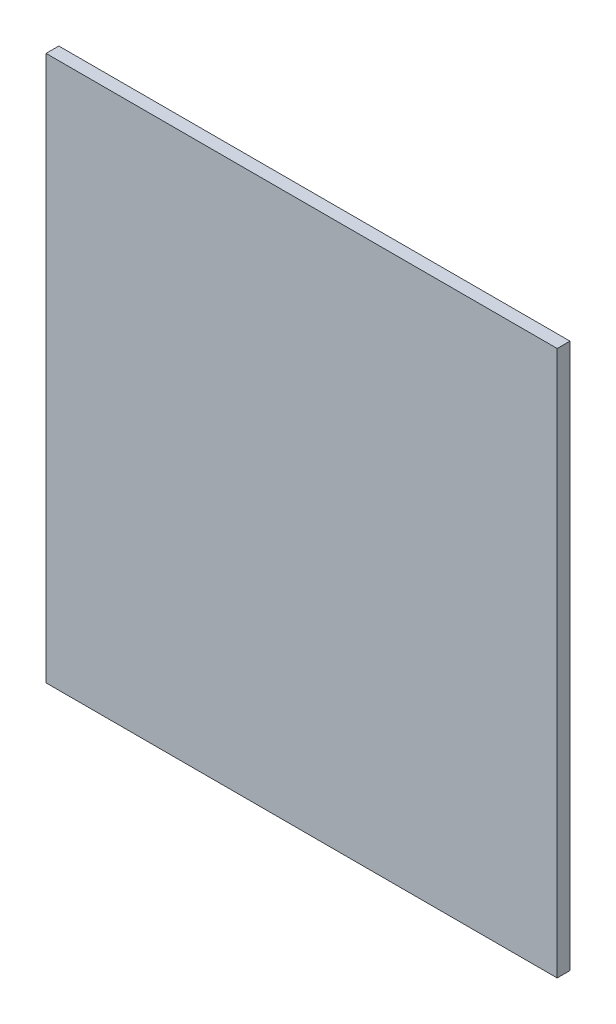
ISO-10303-21;
HEADER;
FILE_DESCRIPTION(('STEP AP214'),'2;1');
FILE_NAME('part.step','',(''),(''),'','','');
FILE_SCHEMA(('AUTOMOTIVE_DESIGN { 1 0 10303 214 1 1 1 1 }'));
ENDSEC;
DATA;
#1=APPLICATION_CONTEXT('core data for automotive mechanical design processes');
#2=APPLICATION_PROTOCOL_DEFINITION('international standard','automotive_design',2000,#1);
#3=PRODUCT_CONTEXT('',#1,'mechanical');
#4=PRODUCT('Part','Part','',(#3));
#5=PRODUCT_RELATED_PRODUCT_CATEGORY('part','',(#4));
#6=PRODUCT_DEFINITION_FORMATION('','',#4);
#7=PRODUCT_DEFINITION_CONTEXT('part definition',#1,'design');
#8=PRODUCT_DEFINITION('design','',#6,#7);
#9=PRODUCT_DEFINITION_SHAPE('','',#8);
#10=(LENGTH_UNIT() NAMED_UNIT(*) SI_UNIT(.MILLI.,.METRE.));
#11=(NAMED_UNIT(*) PLANE_ANGLE_UNIT() SI_UNIT($,.RADIAN.));
#12=(NAMED_UNIT(*) SI_UNIT($,.STERADIAN.) SOLID_ANGLE_UNIT());
#13=UNCERTAINTY_MEASURE_WITH_UNIT(LENGTH_MEASURE(1.E-05),#10,'distance_accuracy_value','');
#14=(GEOMETRIC_REPRESENTATION_CONTEXT(3) GLOBAL_UNCERTAINTY_ASSIGNED_CONTEXT((#13)) GLOBAL_UNIT_ASSIGNED_CONTEXT((#10,
#11,#12)) REPRESENTATION_CONTEXT('',''));
#15=CARTESIAN_POINT('',(0.,0.,0.));
#16=DIRECTION('',(0.,0.,1.));
#17=DIRECTION('',(1.,0.,0.));
#18=AXIS2_PLACEMENT_3D('',#15,#16,#17);
#19=CARTESIAN_POINT('',(0.,0.,0.));
#20=DIRECTION('',(0.,0.,-1.));
#21=DIRECTION('',(-1.,0.,0.));
#22=AXIS2_PLACEMENT_3D('',#19,#20,#21);
#23=PLANE('',#22);
#24=DIRECTION('',(0.,-1.,0.));
#25=VECTOR('',#24,1.);
#26=CARTESIAN_POINT('',(-200.,213.32,0.));
#27=LINE('',#26,#25);
#28=CARTESIAN_POINT('',(-200.,213.32,0.));
#29=VERTEX_POINT('',#28);
#30=CARTESIAN_POINT('',(-200.,-213.32,0.));
#31=VERTEX_POINT('',#30);
#32=EDGE_CURVE('E447',#29,#31,#27,.T.);
#33=ORIENTED_EDGE('',*,*,#32,.F.);
#34=DIRECTION('',(-1.,0.,0.));
#35=VECTOR('',#34,1.);
#36=CARTESIAN_POINT('',(200.,213.32,0.));
#37=LINE('',#36,#35);
#38=CARTESIAN_POINT('',(200.,213.32,0.));
#39=VERTEX_POINT('',#38);
#40=EDGE_CURVE('E453',#39,#29,#37,.T.);
#41=ORIENTED_EDGE('',*,*,#40,.F.);
#42=DIRECTION('',(0.,1.,0.));
#43=VECTOR('',#42,1.);
#44=CARTESIAN_POINT('',(200.,213.32,0.));
#45=LINE('',#44,#43);
#46=CARTESIAN_POINT('',(200.,-213.32,0.));
#47=VERTEX_POINT('',#46);
#48=EDGE_CURVE('E469',#47,#39,#45,.T.);
#49=ORIENTED_EDGE('',*,*,#48,.F.);
#50=DIRECTION('',(1.,0.,0.));
#51=VECTOR('',#50,1.);
#52=CARTESIAN_POINT('',(200.,-213.32,0.));
#53=LINE('',#52,#51);
#54=EDGE_CURVE('E466',#31,#47,#53,.T.);
#55=ORIENTED_EDGE('',*,*,#54,.F.);
#56=EDGE_LOOP('',(#33,#41,#49,#55));
#57=FACE_BOUND('',#56,.T.);
#58=DIRECTION('',(0.866025403784438,0.500000000000001,0.));
#59=VECTOR('',#58,1.);
#60=CARTESIAN_POINT('',(116.379888510882,-201.575879880048,0.));
#61=LINE('',#60,#59);
#62=CARTESIAN_POINT('',(159.,-176.969147038914,0.));
#63=VERTEX_POINT('',#62);
#64=CARTESIAN_POINT('',(170.,-170.618294077828,0.));
#65=VERTEX_POINT('',#64);
#66=EDGE_CURVE('E411',#63,#65,#61,.T.);
#67=ORIENTED_EDGE('',*,*,#66,.F.);
#68=DIRECTION('',(0.,1.,0.));
#69=VECTOR('',#68,1.);
#70=CARTESIAN_POINT('',(159.,0.,0.));
#71=LINE('',#70,#69);
#72=CARTESIAN_POINT('',(159.,-189.670852961086,0.));
#73=VERTEX_POINT('',#72);
#74=EDGE_CURVE('E386',#73,#63,#71,.T.);
#75=ORIENTED_EDGE('',*,*,#74,.F.);
#76=DIRECTION('',(-0.866025403784438,0.5,0.));
#77=VECTOR('',#76,1.);
#78=CARTESIAN_POINT('',(-42.3798885108816,-73.4041201199513,0.));
#79=LINE('',#78,#77);
#80=CARTESIAN_POINT('',(170.,-196.021705922172,0.));
#81=VERTEX_POINT('',#80);
#82=EDGE_CURVE('E392',#81,#73,#79,.T.);
#83=ORIENTED_EDGE('',*,*,#82,.F.);
#84=DIRECTION('',(-0.866025403784439,-0.5,0.));
#85=VECTOR('',#84,1.);
#86=CARTESIAN_POINT('',(127.379888510882,-220.628438763306,0.));
#87=LINE('',#86,#85);
#88=CARTESIAN_POINT('',(181.,-189.670852961086,0.));
#89=VERTEX_POINT('',#88);
#90=EDGE_CURVE('E420',#89,#81,#87,.T.);
#91=ORIENTED_EDGE('',*,*,#90,.F.);
#92=DIRECTION('',(0.,-1.,0.));
#93=VECTOR('',#92,1.);
#94=CARTESIAN_POINT('',(181.,0.,0.));
#95=LINE('',#94,#93);
#96=CARTESIAN_POINT('',(181.,-176.969147038914,0.));
#97=VERTEX_POINT('',#96);
#98=EDGE_CURVE('E417',#97,#89,#95,.T.);
#99=ORIENTED_EDGE('',*,*,#98,.F.);
#100=DIRECTION('',(0.866025403784438,-0.500000000000001,0.));
#101=VECTOR('',#100,1.);
#102=CARTESIAN_POINT('',(-31.3798885108816,-54.3515612366936,0.));
#103=LINE('',#102,#101);
#104=EDGE_CURVE('E414',#65,#97,#103,.T.);
#105=ORIENTED_EDGE('',*,*,#104,.F.);
#106=EDGE_LOOP('',(#67,#75,#83,#91,#99,#105));
#107=FACE_BOUND('',#106,.T.);
#108=DIRECTION('',(0.866025403784438,0.5,0.));
#109=VECTOR('',#108,1.);
#110=CARTESIAN_POINT('',(31.3798885108816,-54.3515612366938,0.));
#111=LINE('',#110,#109);
#112=CARTESIAN_POINT('',(-181.,-176.969147038914,0.));
#113=VERTEX_POINT('',#112);
#114=CARTESIAN_POINT('',(-170.,-170.618294077828,0.));
#115=VERTEX_POINT('',#114);
#116=EDGE_CURVE('E350',#113,#115,#111,.T.);
#117=ORIENTED_EDGE('',*,*,#116,.F.);
#118=DIRECTION('',(0.,1.,0.));
#119=VECTOR('',#118,1.);
#120=CARTESIAN_POINT('',(-181.,0.,0.));
#121=LINE('',#120,#119);
#122=CARTESIAN_POINT('',(-181.,-189.670852961086,0.));
#123=VERTEX_POINT('',#122);
#124=EDGE_CURVE('E325',#123,#113,#121,.T.);
#125=ORIENTED_EDGE('',*,*,#124,.F.);
#126=DIRECTION('',(-0.866025403784438,0.5,0.));
#127=VECTOR('',#126,1.);
#128=CARTESIAN_POINT('',(-127.379888510882,-220.628438763306,0.));
#129=LINE('',#128,#127);
#130=CARTESIAN_POINT('',(-170.,-196.021705922172,0.));
#131=VERTEX_POINT('',#130);
#132=EDGE_CURVE('E331',#131,#123,#129,.T.);
#133=ORIENTED_EDGE('',*,*,#132,.F.);
#134=DIRECTION('',(-0.866025403784438,-0.5,0.));
#135=VECTOR('',#134,1.);
#136=CARTESIAN_POINT('',(42.3798885108816,-73.4041201199514,0.));
#137=LINE('',#136,#135);
#138=CARTESIAN_POINT('',(-159.,-189.670852961086,0.));
#139=VERTEX_POINT('',#138);
#140=EDGE_CURVE('E359',#139,#131,#137,.T.);
#141=ORIENTED_EDGE('',*,*,#140,.F.);
#142=DIRECTION('',(0.,-1.,0.));
#143=VECTOR('',#142,1.);
#144=CARTESIAN_POINT('',(-159.,0.,0.));
#145=LINE('',#144,#143);
#146=CARTESIAN_POINT('',(-159.,-176.969147038914,0.));
#147=VERTEX_POINT('',#146);
#148=EDGE_CURVE('E356',#147,#139,#145,.T.);
#149=ORIENTED_EDGE('',*,*,#148,.F.);
#150=DIRECTION('',(0.866025403784438,-0.5,0.));
#151=VECTOR('',#150,1.);
#152=CARTESIAN_POINT('',(-116.379888510882,-201.575879880048,0.));
#153=LINE('',#152,#151);
#154=EDGE_CURVE('E353',#115,#147,#153,.T.);
#155=ORIENTED_EDGE('',*,*,#154,.F.);
#156=EDGE_LOOP('',(#117,#125,#133,#141,#149,#155));
#157=FACE_BOUND('',#156,.T.);
#158=DIRECTION('',(-0.866025403784439,-0.499999999999999,0.));
#159=VECTOR('',#158,1.);
#160=CARTESIAN_POINT('',(-31.3798885108817,54.3515612366942,0.));
#161=LINE('',#160,#159);
#162=CARTESIAN_POINT('',(181.,176.969147038914,0.));
#163=VERTEX_POINT('',#162);
#164=CARTESIAN_POINT('',(170.,170.618294077828,0.));
#165=VERTEX_POINT('',#164);
#166=EDGE_CURVE('E265',#163,#165,#161,.T.);
#167=ORIENTED_EDGE('',*,*,#166,.F.);
#168=DIRECTION('',(0.,-1.,0.));
#169=VECTOR('',#168,1.);
#170=CARTESIAN_POINT('',(181.,0.,0.));
#171=LINE('',#170,#169);
#172=CARTESIAN_POINT('',(181.,189.670852961086,0.));
#173=VERTEX_POINT('',#172);
#174=EDGE_CURVE('E260',#173,#163,#171,.T.);
#175=ORIENTED_EDGE('',*,*,#174,.F.);
#176=DIRECTION('',(0.866025403784439,-0.5,0.));
#177=VECTOR('',#176,1.);
#178=CARTESIAN_POINT('',(127.379888510882,220.628438763306,0.));
#179=LINE('',#178,#177);
#180=CARTESIAN_POINT('',(170.,196.021705922172,0.));
#181=VERTEX_POINT('',#180);
#182=EDGE_CURVE('E276',#181,#173,#179,.T.);
#183=ORIENTED_EDGE('',*,*,#182,.F.);
#184=DIRECTION('',(0.866025403784439,0.499999999999999,0.));
#185=VECTOR('',#184,1.);
#186=CARTESIAN_POINT('',(-42.3798885108817,73.4041201199518,0.));
#187=LINE('',#186,#185);
#188=CARTESIAN_POINT('',(159.,189.670852961086,0.));
#189=VERTEX_POINT('',#188);
#190=EDGE_CURVE('E300',#189,#181,#187,.T.);
#191=ORIENTED_EDGE('',*,*,#190,.F.);
#192=DIRECTION('',(0.,1.,0.));
#193=VECTOR('',#192,1.);
#194=CARTESIAN_POINT('',(159.,0.,0.));
#195=LINE('',#194,#193);
#196=CARTESIAN_POINT('',(159.,176.969147038914,0.));
#197=VERTEX_POINT('',#196);
#198=EDGE_CURVE('E297',#197,#189,#195,.T.);
#199=ORIENTED_EDGE('',*,*,#198,.F.);
#200=DIRECTION('',(-0.866025403784439,0.5,0.));
#201=VECTOR('',#200,1.);
#202=CARTESIAN_POINT('',(116.379888510882,201.575879880049,0.));
#203=LINE('',#202,#201);
#204=EDGE_CURVE('E294',#165,#197,#203,.T.);
#205=ORIENTED_EDGE('',*,*,#204,.F.);
#206=EDGE_LOOP('',(#167,#175,#183,#191,#199,#205));
#207=FACE_BOUND('',#206,.T.);
#208=DIRECTION('',(-0.866025403784438,-0.500000000000001,0.));
#209=VECTOR('',#208,1.);
#210=CARTESIAN_POINT('',(-116.379888510882,201.575879880048,0.));
#211=LINE('',#210,#209);
#212=CARTESIAN_POINT('',(-159.,176.969147038914,0.));
#213=VERTEX_POINT('',#212);
#214=CARTESIAN_POINT('',(-170.,170.618294077828,0.));
#215=VERTEX_POINT('',#214);
#216=EDGE_CURVE('E899',#213,#215,#211,.T.);
#217=ORIENTED_EDGE('',*,*,#216,.F.);
#218=DIRECTION('',(0.,-1.,0.));
#219=VECTOR('',#218,1.);
#220=CARTESIAN_POINT('',(-159.,0.,0.));
#221=LINE('',#220,#219);
#222=CARTESIAN_POINT('',(-159.,189.670852961086,0.));
#223=VERTEX_POINT('',#222);
#224=EDGE_CURVE('E257',#223,#213,#221,.T.);
#225=ORIENTED_EDGE('',*,*,#224,.F.);
#226=DIRECTION('',(0.866025403784439,-0.499999999999999,0.));
#227=VECTOR('',#226,1.);
#228=CARTESIAN_POINT('',(42.3798885108817,73.4041201199518,0.));
#229=LINE('',#228,#227);
#230=CARTESIAN_POINT('',(-170.,196.021705922172,0.));
#231=VERTEX_POINT('',#230);
#232=EDGE_CURVE('E253',#231,#223,#229,.T.);
#233=ORIENTED_EDGE('',*,*,#232,.F.);
#234=DIRECTION('',(0.866025403784439,0.499999999999999,0.));
#235=VECTOR('',#234,1.);
#236=CARTESIAN_POINT('',(-127.379888510881,220.628438763306,0.));
#237=LINE('',#236,#235);
#238=CARTESIAN_POINT('',(-181.,189.670852961086,0.));
#239=VERTEX_POINT('',#238);
#240=EDGE_CURVE('E894',#239,#231,#237,.T.);
#241=ORIENTED_EDGE('',*,*,#240,.F.);
#242=DIRECTION('',(0.,1.,0.));
#243=VECTOR('',#242,1.);
#244=CARTESIAN_POINT('',(-181.,0.,0.));
#245=LINE('',#244,#243);
#246=CARTESIAN_POINT('',(-181.,176.969147038914,0.));
#247=VERTEX_POINT('',#246);
#248=EDGE_CURVE('E910',#247,#239,#245,.T.);
#249=ORIENTED_EDGE('',*,*,#248,.F.);
#250=DIRECTION('',(-0.866025403784438,0.500000000000001,0.));
#251=VECTOR('',#250,1.);
#252=CARTESIAN_POINT('',(31.3798885108816,54.3515612366936,0.));
#253=LINE('',#252,#251);
#254=EDGE_CURVE('E903',#215,#247,#253,.T.);
#255=ORIENTED_EDGE('',*,*,#254,.F.);
#256=EDGE_LOOP('',(#217,#225,#233,#241,#249,#255));
#257=FACE_BOUND('',#256,.T.);
#258=ADVANCED_FACE('F45',(#57,#107,#157,#207,#257),#23,.T.);
#259=CARTESIAN_POINT('',(-200.,213.32,10.));
#260=DIRECTION('',(1.,0.,0.));
#261=DIRECTION('',(0.,1.,0.));
#262=AXIS2_PLACEMENT_3D('',#259,#260,#261);
#263=PLANE('',#262);
#264=ORIENTED_EDGE('',*,*,#32,.T.);
#265=DIRECTION('',(0.,0.,-1.));
#266=VECTOR('',#265,1.);
#267=CARTESIAN_POINT('',(-200.,-213.32,10.));
#268=LINE('',#267,#266);
#269=CARTESIAN_POINT('',(-200.,-213.32,10.));
#270=VERTEX_POINT('',#269);
#271=EDGE_CURVE('E11',#270,#31,#268,.T.);
#272=ORIENTED_EDGE('',*,*,#271,.F.);
#273=DIRECTION('',(0.,-1.,0.));
#274=VECTOR('',#273,1.);
#275=CARTESIAN_POINT('',(-200.,213.32,10.));
#276=LINE('',#275,#274);
#277=CARTESIAN_POINT('',(-200.,213.32,10.));
#278=VERTEX_POINT('',#277);
#279=EDGE_CURVE('E448',#278,#270,#276,.T.);
#280=ORIENTED_EDGE('',*,*,#279,.F.);
#281=DIRECTION('',(0.,0.,-1.));
#282=VECTOR('',#281,1.);
#283=CARTESIAN_POINT('',(-200.,213.32,10.));
#284=LINE('',#283,#282);
#285=EDGE_CURVE('E462',#278,#29,#284,.T.);
#286=ORIENTED_EDGE('',*,*,#285,.T.);
#287=EDGE_LOOP('',(#264,#272,#280,#286));
#288=FACE_BOUND('',#287,.T.);
#289=ADVANCED_FACE('F47',(#288),#263,.F.);
#290=CARTESIAN_POINT('',(200.,-213.32,10.));
#291=DIRECTION('',(0.,1.,0.));
#292=DIRECTION('',(-1.,0.,0.));
#293=AXIS2_PLACEMENT_3D('',#290,#291,#292);
#294=PLANE('',#293);
#295=ORIENTED_EDGE('',*,*,#54,.T.);
#296=DIRECTION('',(0.,0.,-1.));
#297=VECTOR('',#296,1.);
#298=CARTESIAN_POINT('',(200.,-213.32,10.));
#299=LINE('',#298,#297);
#300=CARTESIAN_POINT('',(200.,-213.32,10.));
#301=VERTEX_POINT('',#300);
#302=EDGE_CURVE('E54',#301,#47,#299,.T.);
#303=ORIENTED_EDGE('',*,*,#302,.F.);
#304=DIRECTION('',(1.,0.,0.));
#305=VECTOR('',#304,1.);
#306=CARTESIAN_POINT('',(200.,-213.32,10.));
#307=LINE('',#306,#305);
#308=EDGE_CURVE('E452',#270,#301,#307,.T.);
#309=ORIENTED_EDGE('',*,*,#308,.F.);
#310=ORIENTED_EDGE('',*,*,#271,.T.);
#311=EDGE_LOOP('',(#295,#303,#309,#310));
#312=FACE_BOUND('',#311,.T.);
#313=ADVANCED_FACE('F502',(#312),#294,.F.);
#314=CARTESIAN_POINT('',(200.,213.32,10.));
#315=DIRECTION('',(-1.,0.,0.));
#316=DIRECTION('',(0.,-1.,0.));
#317=AXIS2_PLACEMENT_3D('',#314,#315,#316);
#318=PLANE('',#317);
#319=ORIENTED_EDGE('',*,*,#48,.T.);
#320=DIRECTION('',(0.,0.,-1.));
#321=VECTOR('',#320,1.);
#322=CARTESIAN_POINT('',(200.,213.32,10.));
#323=LINE('',#322,#321);
#324=CARTESIAN_POINT('',(200.,213.32,10.));
#325=VERTEX_POINT('',#324);
#326=EDGE_CURVE('E477',#325,#39,#323,.T.);
#327=ORIENTED_EDGE('',*,*,#326,.F.);
#328=DIRECTION('',(0.,1.,0.));
#329=VECTOR('',#328,1.);
#330=CARTESIAN_POINT('',(200.,213.32,10.));
#331=LINE('',#330,#329);
#332=EDGE_CURVE('E456',#301,#325,#331,.T.);
#333=ORIENTED_EDGE('',*,*,#332,.F.);
#334=ORIENTED_EDGE('',*,*,#302,.T.);
#335=EDGE_LOOP('',(#319,#327,#333,#334));
#336=FACE_BOUND('',#335,.T.);
#337=ADVANCED_FACE('F486',(#336),#318,.F.);
#338=CARTESIAN_POINT('',(200.,213.32,10.));
#339=DIRECTION('',(0.,-1.,0.));
#340=DIRECTION('',(1.,0.,0.));
#341=AXIS2_PLACEMENT_3D('',#338,#339,#340);
#342=PLANE('',#341);
#343=ORIENTED_EDGE('',*,*,#40,.T.);
#344=ORIENTED_EDGE('',*,*,#285,.F.);
#345=DIRECTION('',(-1.,0.,0.));
#346=VECTOR('',#345,1.);
#347=CARTESIAN_POINT('',(200.,213.32,10.));
#348=LINE('',#347,#346);
#349=EDGE_CURVE('E459',#325,#278,#348,.T.);
#350=ORIENTED_EDGE('',*,*,#349,.F.);
#351=ORIENTED_EDGE('',*,*,#326,.T.);
#352=EDGE_LOOP('',(#343,#344,#350,#351));
#353=FACE_BOUND('',#352,.T.);
#354=ADVANCED_FACE('F495',(#353),#342,.F.);
#355=CARTESIAN_POINT('',(0.,0.,10.));
#356=DIRECTION('',(0.,0.,-1.));
#357=DIRECTION('',(-1.,0.,0.));
#358=AXIS2_PLACEMENT_3D('',#355,#356,#357);
#359=PLANE('',#358);
#360=ORIENTED_EDGE('',*,*,#279,.T.);
#361=ORIENTED_EDGE('',*,*,#308,.T.);
#362=ORIENTED_EDGE('',*,*,#332,.T.);
#363=ORIENTED_EDGE('',*,*,#349,.T.);
#364=EDGE_LOOP('',(#360,#361,#362,#363));
#365=FACE_BOUND('',#364,.T.);
#366=ADVANCED_FACE('F501',(#365),#359,.F.);
#367=CARTESIAN_POINT('',(159.,0.,-10.));
#368=DIRECTION('',(1.,0.,0.));
#369=DIRECTION('',(0.,0.,-1.));
#370=AXIS2_PLACEMENT_3D('',#367,#368,#369);
#371=PLANE('',#370);
#372=ORIENTED_EDGE('',*,*,#74,.T.);
#373=DIRECTION('',(0.,0.,1.));
#374=VECTOR('',#373,1.);
#375=CARTESIAN_POINT('',(159.,-176.969147038914,-10.));
#376=LINE('',#375,#374);
#377=CARTESIAN_POINT('',(159.,-176.969147038914,-10.));
#378=VERTEX_POINT('',#377);
#379=EDGE_CURVE('E444',#378,#63,#376,.T.);
#380=ORIENTED_EDGE('',*,*,#379,.F.);
#381=DIRECTION('',(0.,1.,0.));
#382=VECTOR('',#381,1.);
#383=CARTESIAN_POINT('',(159.,0.,-10.));
#384=LINE('',#383,#382);
#385=CARTESIAN_POINT('',(159.,-189.670852961086,-10.));
#386=VERTEX_POINT('',#385);
#387=EDGE_CURVE('E387',#386,#378,#384,.T.);
#388=ORIENTED_EDGE('',*,*,#387,.F.);
#389=DIRECTION('',(0.,0.,1.));
#390=VECTOR('',#389,1.);
#391=CARTESIAN_POINT('',(159.,-189.670852961086,-10.));
#392=LINE('',#391,#390);
#393=EDGE_CURVE('E407',#386,#73,#392,.T.);
#394=ORIENTED_EDGE('',*,*,#393,.T.);
#395=EDGE_LOOP('',(#372,#380,#388,#394));
#396=FACE_BOUND('',#395,.T.);
#397=ADVANCED_FACE('F520',(#396),#371,.F.);
#398=CARTESIAN_POINT('',(116.379888510882,-201.575879880048,-10.));
#399=DIRECTION('',(0.500000000000001,-0.866025403784438,0.));
#400=DIRECTION('',(0.866025403784438,0.500000000000001,0.));
#401=AXIS2_PLACEMENT_3D('',#398,#399,#400);
#402=PLANE('',#401);
#403=ORIENTED_EDGE('',*,*,#66,.T.);
#404=DIRECTION('',(0.,0.,1.));
#405=VECTOR('',#404,1.);
#406=CARTESIAN_POINT('',(170.,-170.618294077828,-10.));
#407=LINE('',#406,#405);
#408=CARTESIAN_POINT('',(170.,-170.618294077828,-10.));
#409=VERTEX_POINT('',#408);
#410=EDGE_CURVE('E440',#409,#65,#407,.T.);
#411=ORIENTED_EDGE('',*,*,#410,.F.);
#412=DIRECTION('',(0.866025403784438,0.500000000000001,0.));
#413=VECTOR('',#412,1.);
#414=CARTESIAN_POINT('',(116.379888510882,-201.575879880048,-10.));
#415=LINE('',#414,#413);
#416=EDGE_CURVE('E391',#378,#409,#415,.T.);
#417=ORIENTED_EDGE('',*,*,#416,.F.);
#418=ORIENTED_EDGE('',*,*,#379,.T.);
#419=EDGE_LOOP('',(#403,#411,#417,#418));
#420=FACE_BOUND('',#419,.T.);
#421=ADVANCED_FACE('F524',(#420),#402,.F.);
#422=CARTESIAN_POINT('',(-31.3798885108816,-54.3515612366936,-10.));
#423=DIRECTION('',(-0.500000000000001,-0.866025403784438,0.));
#424=DIRECTION('',(0.866025403784438,-0.500000000000001,0.));
#425=AXIS2_PLACEMENT_3D('',#422,#423,#424);
#426=PLANE('',#425);
#427=ORIENTED_EDGE('',*,*,#104,.T.);
#428=DIRECTION('',(0.,0.,1.));
#429=VECTOR('',#428,1.);
#430=CARTESIAN_POINT('',(181.,-176.969147038914,-10.));
#431=LINE('',#430,#429);
#432=CARTESIAN_POINT('',(181.,-176.969147038914,-10.));
#433=VERTEX_POINT('',#432);
#434=EDGE_CURVE('E436',#433,#97,#431,.T.);
#435=ORIENTED_EDGE('',*,*,#434,.F.);
#436=DIRECTION('',(0.866025403784438,-0.500000000000001,0.));
#437=VECTOR('',#436,1.);
#438=CARTESIAN_POINT('',(-31.3798885108816,-54.3515612366936,-10.));
#439=LINE('',#438,#437);
#440=EDGE_CURVE('E395',#409,#433,#439,.T.);
#441=ORIENTED_EDGE('',*,*,#440,.F.);
#442=ORIENTED_EDGE('',*,*,#410,.T.);
#443=EDGE_LOOP('',(#427,#435,#441,#442));
#444=FACE_BOUND('',#443,.T.);
#445=ADVANCED_FACE('F529',(#444),#426,.F.);
#446=CARTESIAN_POINT('',(181.,0.,-10.));
#447=DIRECTION('',(-1.,0.,0.));
#448=DIRECTION('',(0.,0.,1.));
#449=AXIS2_PLACEMENT_3D('',#446,#447,#448);
#450=PLANE('',#449);
#451=ORIENTED_EDGE('',*,*,#98,.T.);
#452=DIRECTION('',(0.,0.,1.));
#453=VECTOR('',#452,1.);
#454=CARTESIAN_POINT('',(181.,-189.670852961086,-10.));
#455=LINE('',#454,#453);
#456=CARTESIAN_POINT('',(181.,-189.670852961086,-10.));
#457=VERTEX_POINT('',#456);
#458=EDGE_CURVE('E432',#457,#89,#455,.T.);
#459=ORIENTED_EDGE('',*,*,#458,.F.);
#460=DIRECTION('',(0.,-1.,0.));
#461=VECTOR('',#460,1.);
#462=CARTESIAN_POINT('',(181.,0.,-10.));
#463=LINE('',#462,#461);
#464=EDGE_CURVE('E398',#433,#457,#463,.T.);
#465=ORIENTED_EDGE('',*,*,#464,.F.);
#466=ORIENTED_EDGE('',*,*,#434,.T.);
#467=EDGE_LOOP('',(#451,#459,#465,#466));
#468=FACE_BOUND('',#467,.T.);
#469=ADVANCED_FACE('F535',(#468),#450,.F.);
#470=CARTESIAN_POINT('',(127.379888510882,-220.628438763306,-10.));
#471=DIRECTION('',(-0.5,0.866025403784439,0.));
#472=DIRECTION('',(-0.866025403784439,-0.5,0.));
#473=AXIS2_PLACEMENT_3D('',#470,#471,#472);
#474=PLANE('',#473);
#475=ORIENTED_EDGE('',*,*,#90,.T.);
#476=DIRECTION('',(0.,0.,1.));
#477=VECTOR('',#476,1.);
#478=CARTESIAN_POINT('',(170.,-196.021705922172,-10.));
#479=LINE('',#478,#477);
#480=CARTESIAN_POINT('',(170.,-196.021705922172,-10.));
#481=VERTEX_POINT('',#480);
#482=EDGE_CURVE('E429',#481,#81,#479,.T.);
#483=ORIENTED_EDGE('',*,*,#482,.F.);
#484=DIRECTION('',(-0.866025403784439,-0.5,0.));
#485=VECTOR('',#484,1.);
#486=CARTESIAN_POINT('',(127.379888510882,-220.628438763306,-10.));
#487=LINE('',#486,#485);
#488=EDGE_CURVE('E401',#457,#481,#487,.T.);
#489=ORIENTED_EDGE('',*,*,#488,.F.);
#490=ORIENTED_EDGE('',*,*,#458,.T.);
#491=EDGE_LOOP('',(#475,#483,#489,#490));
#492=FACE_BOUND('',#491,.T.);
#493=ADVANCED_FACE('F539',(#492),#474,.F.);
#494=CARTESIAN_POINT('',(-42.3798885108816,-73.4041201199513,-10.));
#495=DIRECTION('',(0.5,0.866025403784438,0.));
#496=DIRECTION('',(-0.866025403784438,0.5,0.));
#497=AXIS2_PLACEMENT_3D('',#494,#495,#496);
#498=PLANE('',#497);
#499=ORIENTED_EDGE('',*,*,#82,.T.);
#500=ORIENTED_EDGE('',*,*,#393,.F.);
#501=DIRECTION('',(-0.866025403784438,0.5,0.));
#502=VECTOR('',#501,1.);
#503=CARTESIAN_POINT('',(-42.3798885108816,-73.4041201199513,-10.));
#504=LINE('',#503,#502);
#505=EDGE_CURVE('E404',#481,#386,#504,.T.);
#506=ORIENTED_EDGE('',*,*,#505,.F.);
#507=ORIENTED_EDGE('',*,*,#482,.T.);
#508=EDGE_LOOP('',(#499,#500,#506,#507));
#509=FACE_BOUND('',#508,.T.);
#510=ADVANCED_FACE('F543',(#509),#498,.F.);
#511=CARTESIAN_POINT('',(0.,0.,-10.));
#512=DIRECTION('',(0.,0.,-1.));
#513=DIRECTION('',(-1.,0.,0.));
#514=AXIS2_PLACEMENT_3D('',#511,#512,#513);
#515=PLANE('',#514);
#516=ORIENTED_EDGE('',*,*,#387,.T.);
#517=ORIENTED_EDGE('',*,*,#416,.T.);
#518=ORIENTED_EDGE('',*,*,#440,.T.);
#519=ORIENTED_EDGE('',*,*,#464,.T.);
#520=ORIENTED_EDGE('',*,*,#488,.T.);
#521=ORIENTED_EDGE('',*,*,#505,.T.);
#522=EDGE_LOOP('',(#516,#517,#518,#519,#520,#521));
#523=FACE_BOUND('',#522,.T.);
#524=ADVANCED_FACE('F547',(#523),#515,.T.);
#525=CARTESIAN_POINT('',(-181.,0.,-10.));
#526=DIRECTION('',(1.,0.,0.));
#527=DIRECTION('',(0.,0.,-1.));
#528=AXIS2_PLACEMENT_3D('',#525,#526,#527);
#529=PLANE('',#528);
#530=ORIENTED_EDGE('',*,*,#124,.T.);
#531=DIRECTION('',(0.,0.,1.));
#532=VECTOR('',#531,1.);
#533=CARTESIAN_POINT('',(-181.,-176.969147038914,-10.));
#534=LINE('',#533,#532);
#535=CARTESIAN_POINT('',(-181.,-176.969147038914,-10.));
#536=VERTEX_POINT('',#535);
#537=EDGE_CURVE('E383',#536,#113,#534,.T.);
#538=ORIENTED_EDGE('',*,*,#537,.F.);
#539=DIRECTION('',(0.,1.,0.));
#540=VECTOR('',#539,1.);
#541=CARTESIAN_POINT('',(-181.,0.,-10.));
#542=LINE('',#541,#540);
#543=CARTESIAN_POINT('',(-181.,-189.670852961086,-10.));
#544=VERTEX_POINT('',#543);
#545=EDGE_CURVE('E326',#544,#536,#542,.T.);
#546=ORIENTED_EDGE('',*,*,#545,.F.);
#547=DIRECTION('',(0.,0.,1.));
#548=VECTOR('',#547,1.);
#549=CARTESIAN_POINT('',(-181.,-189.670852961086,-10.));
#550=LINE('',#549,#548);
#551=EDGE_CURVE('E346',#544,#123,#550,.T.);
#552=ORIENTED_EDGE('',*,*,#551,.T.);
#553=EDGE_LOOP('',(#530,#538,#546,#552));
#554=FACE_BOUND('',#553,.T.);
#555=ADVANCED_FACE('F551',(#554),#529,.F.);
#556=CARTESIAN_POINT('',(31.3798885108816,-54.3515612366938,-10.));
#557=DIRECTION('',(0.5,-0.866025403784438,0.));
#558=DIRECTION('',(0.866025403784438,0.5,0.));
#559=AXIS2_PLACEMENT_3D('',#556,#557,#558);
#560=PLANE('',#559);
#561=ORIENTED_EDGE('',*,*,#116,.T.);
#562=DIRECTION('',(0.,0.,1.));
#563=VECTOR('',#562,1.);
#564=CARTESIAN_POINT('',(-170.,-170.618294077828,-10.));
#565=LINE('',#564,#563);
#566=CARTESIAN_POINT('',(-170.,-170.618294077828,-10.));
#567=VERTEX_POINT('',#566);
#568=EDGE_CURVE('E379',#567,#115,#565,.T.);
#569=ORIENTED_EDGE('',*,*,#568,.F.);
#570=DIRECTION('',(0.866025403784438,0.5,0.));
#571=VECTOR('',#570,1.);
#572=CARTESIAN_POINT('',(31.3798885108816,-54.3515612366938,-10.));
#573=LINE('',#572,#571);
#574=EDGE_CURVE('E330',#536,#567,#573,.T.);
#575=ORIENTED_EDGE('',*,*,#574,.F.);
#576=ORIENTED_EDGE('',*,*,#537,.T.);
#577=EDGE_LOOP('',(#561,#569,#575,#576));
#578=FACE_BOUND('',#577,.T.);
#579=ADVANCED_FACE('F555',(#578),#560,.F.);
#580=CARTESIAN_POINT('',(-116.379888510882,-201.575879880048,-10.));
#581=DIRECTION('',(-0.5,-0.866025403784438,0.));
#582=DIRECTION('',(0.866025403784438,-0.5,0.));
#583=AXIS2_PLACEMENT_3D('',#580,#581,#582);
#584=PLANE('',#583);
#585=ORIENTED_EDGE('',*,*,#154,.T.);
#586=DIRECTION('',(0.,0.,1.));
#587=VECTOR('',#586,1.);
#588=CARTESIAN_POINT('',(-159.,-176.969147038914,-10.));
#589=LINE('',#588,#587);
#590=CARTESIAN_POINT('',(-159.,-176.969147038914,-10.));
#591=VERTEX_POINT('',#590);
#592=EDGE_CURVE('E375',#591,#147,#589,.T.);
#593=ORIENTED_EDGE('',*,*,#592,.F.);
#594=DIRECTION('',(0.866025403784438,-0.5,0.));
#595=VECTOR('',#594,1.);
#596=CARTESIAN_POINT('',(-116.379888510882,-201.575879880048,-10.));
#597=LINE('',#596,#595);
#598=EDGE_CURVE('E334',#567,#591,#597,.T.);
#599=ORIENTED_EDGE('',*,*,#598,.F.);
#600=ORIENTED_EDGE('',*,*,#568,.T.);
#601=EDGE_LOOP('',(#585,#593,#599,#600));
#602=FACE_BOUND('',#601,.T.);
#603=ADVANCED_FACE('F559',(#602),#584,.F.);
#604=CARTESIAN_POINT('',(-159.,0.,-10.));
#605=DIRECTION('',(-1.,0.,0.));
#606=DIRECTION('',(0.,0.,1.));
#607=AXIS2_PLACEMENT_3D('',#604,#605,#606);
#608=PLANE('',#607);
#609=ORIENTED_EDGE('',*,*,#148,.T.);
#610=DIRECTION('',(0.,0.,1.));
#611=VECTOR('',#610,1.);
#612=CARTESIAN_POINT('',(-159.,-189.670852961086,-10.));
#613=LINE('',#612,#611);
#614=CARTESIAN_POINT('',(-159.,-189.670852961086,-10.));
#615=VERTEX_POINT('',#614);
#616=EDGE_CURVE('E371',#615,#139,#613,.T.);
#617=ORIENTED_EDGE('',*,*,#616,.F.);
#618=DIRECTION('',(0.,-1.,0.));
#619=VECTOR('',#618,1.);
#620=CARTESIAN_POINT('',(-159.,0.,-10.));
#621=LINE('',#620,#619);
#622=EDGE_CURVE('E337',#591,#615,#621,.T.);
#623=ORIENTED_EDGE('',*,*,#622,.F.);
#624=ORIENTED_EDGE('',*,*,#592,.T.);
#625=EDGE_LOOP('',(#609,#617,#623,#624));
#626=FACE_BOUND('',#625,.T.);
#627=ADVANCED_FACE('F563',(#626),#608,.F.);
#628=CARTESIAN_POINT('',(42.3798885108816,-73.4041201199514,-10.));
#629=DIRECTION('',(-0.5,0.866025403784438,0.));
#630=DIRECTION('',(-0.866025403784438,-0.5,0.));
#631=AXIS2_PLACEMENT_3D('',#628,#629,#630);
#632=PLANE('',#631);
#633=ORIENTED_EDGE('',*,*,#140,.T.);
#634=DIRECTION('',(0.,0.,1.));
#635=VECTOR('',#634,1.);
#636=CARTESIAN_POINT('',(-170.,-196.021705922172,-10.));
#637=LINE('',#636,#635);
#638=CARTESIAN_POINT('',(-170.,-196.021705922172,-10.));
#639=VERTEX_POINT('',#638);
#640=EDGE_CURVE('E368',#639,#131,#637,.T.);
#641=ORIENTED_EDGE('',*,*,#640,.F.);
#642=DIRECTION('',(-0.866025403784438,-0.5,0.));
#643=VECTOR('',#642,1.);
#644=CARTESIAN_POINT('',(42.3798885108816,-73.4041201199514,-10.));
#645=LINE('',#644,#643);
#646=EDGE_CURVE('E340',#615,#639,#645,.T.);
#647=ORIENTED_EDGE('',*,*,#646,.F.);
#648=ORIENTED_EDGE('',*,*,#616,.T.);
#649=EDGE_LOOP('',(#633,#641,#647,#648));
#650=FACE_BOUND('',#649,.T.);
#651=ADVANCED_FACE('F567',(#650),#632,.F.);
#652=CARTESIAN_POINT('',(-127.379888510882,-220.628438763306,-10.));
#653=DIRECTION('',(0.5,0.866025403784438,0.));
#654=DIRECTION('',(-0.866025403784438,0.5,0.));
#655=AXIS2_PLACEMENT_3D('',#652,#653,#654);
#656=PLANE('',#655);
#657=ORIENTED_EDGE('',*,*,#132,.T.);
#658=ORIENTED_EDGE('',*,*,#551,.F.);
#659=DIRECTION('',(-0.866025403784438,0.5,0.));
#660=VECTOR('',#659,1.);
#661=CARTESIAN_POINT('',(-127.379888510882,-220.628438763306,-10.));
#662=LINE('',#661,#660);
#663=EDGE_CURVE('E343',#639,#544,#662,.T.);
#664=ORIENTED_EDGE('',*,*,#663,.F.);
#665=ORIENTED_EDGE('',*,*,#640,.T.);
#666=EDGE_LOOP('',(#657,#658,#664,#665));
#667=FACE_BOUND('',#666,.T.);
#668=ADVANCED_FACE('F571',(#667),#656,.F.);
#669=CARTESIAN_POINT('',(0.,0.,-10.));
#670=DIRECTION('',(0.,0.,-1.));
#671=DIRECTION('',(-1.,0.,0.));
#672=AXIS2_PLACEMENT_3D('',#669,#670,#671);
#673=PLANE('',#672);
#674=ORIENTED_EDGE('',*,*,#545,.T.);
#675=ORIENTED_EDGE('',*,*,#574,.T.);
#676=ORIENTED_EDGE('',*,*,#598,.T.);
#677=ORIENTED_EDGE('',*,*,#622,.T.);
#678=ORIENTED_EDGE('',*,*,#646,.T.);
#679=ORIENTED_EDGE('',*,*,#663,.T.);
#680=EDGE_LOOP('',(#674,#675,#676,#677,#678,#679));
#681=FACE_BOUND('',#680,.T.);
#682=ADVANCED_FACE('F575',(#681),#673,.T.);
#683=CARTESIAN_POINT('',(181.,0.,-10.));
#684=DIRECTION('',(-1.,0.,0.));
#685=DIRECTION('',(0.,0.,1.));
#686=AXIS2_PLACEMENT_3D('',#683,#684,#685);
#687=PLANE('',#686);
#688=ORIENTED_EDGE('',*,*,#174,.T.);
#689=DIRECTION('',(0.,0.,1.));
#690=VECTOR('',#689,1.);
#691=CARTESIAN_POINT('',(181.,176.969147038914,-10.));
#692=LINE('',#691,#690);
#693=CARTESIAN_POINT('',(181.,176.969147038914,-10.));
#694=VERTEX_POINT('',#693);
#695=EDGE_CURVE('E322',#694,#163,#692,.T.);
#696=ORIENTED_EDGE('',*,*,#695,.F.);
#697=DIRECTION('',(0.,-1.,0.));
#698=VECTOR('',#697,1.);
#699=CARTESIAN_POINT('',(181.,0.,-10.));
#700=LINE('',#699,#698);
#701=CARTESIAN_POINT('',(181.,189.670852961086,-10.));
#702=VERTEX_POINT('',#701);
#703=EDGE_CURVE('E271',#702,#694,#700,.T.);
#704=ORIENTED_EDGE('',*,*,#703,.F.);
#705=DIRECTION('',(0.,0.,1.));
#706=VECTOR('',#705,1.);
#707=CARTESIAN_POINT('',(181.,189.670852961086,-10.));
#708=LINE('',#707,#706);
#709=EDGE_CURVE('E290',#702,#173,#708,.T.);
#710=ORIENTED_EDGE('',*,*,#709,.T.);
#711=EDGE_LOOP('',(#688,#696,#704,#710));
#712=FACE_BOUND('',#711,.T.);
#713=ADVANCED_FACE('F579',(#712),#687,.F.);
#714=CARTESIAN_POINT('',(-31.3798885108817,54.3515612366942,-10.));
#715=DIRECTION('',(-0.499999999999999,0.866025403784439,0.));
#716=DIRECTION('',(-0.866025403784439,-0.499999999999999,0.));
#717=AXIS2_PLACEMENT_3D('',#714,#715,#716);
#718=PLANE('',#717);
#719=ORIENTED_EDGE('',*,*,#166,.T.);
#720=DIRECTION('',(0.,0.,1.));
#721=VECTOR('',#720,1.);
#722=CARTESIAN_POINT('',(170.,170.618294077828,-10.));
#723=LINE('',#722,#721);
#724=CARTESIAN_POINT('',(170.,170.618294077828,-10.));
#725=VERTEX_POINT('',#724);
#726=EDGE_CURVE('E318',#725,#165,#723,.T.);
#727=ORIENTED_EDGE('',*,*,#726,.F.);
#728=DIRECTION('',(-0.866025403784439,-0.499999999999999,0.));
#729=VECTOR('',#728,1.);
#730=CARTESIAN_POINT('',(-31.3798885108817,54.3515612366942,-10.));
#731=LINE('',#730,#729);
#732=EDGE_CURVE('E275',#694,#725,#731,.T.);
#733=ORIENTED_EDGE('',*,*,#732,.F.);
#734=ORIENTED_EDGE('',*,*,#695,.T.);
#735=EDGE_LOOP('',(#719,#727,#733,#734));
#736=FACE_BOUND('',#735,.T.);
#737=ADVANCED_FACE('F583',(#736),#718,.F.);
#738=CARTESIAN_POINT('',(116.379888510882,201.575879880049,-10.));
#739=DIRECTION('',(0.5,0.866025403784439,0.));
#740=DIRECTION('',(-0.866025403784439,0.5,0.));
#741=AXIS2_PLACEMENT_3D('',#738,#739,#740);
#742=PLANE('',#741);
#743=ORIENTED_EDGE('',*,*,#204,.T.);
#744=DIRECTION('',(0.,0.,1.));
#745=VECTOR('',#744,1.);
#746=CARTESIAN_POINT('',(159.,176.969147038914,-10.));
#747=LINE('',#746,#745);
#748=CARTESIAN_POINT('',(159.,176.969147038914,-10.));
#749=VERTEX_POINT('',#748);
#750=EDGE_CURVE('E314',#749,#197,#747,.T.);
#751=ORIENTED_EDGE('',*,*,#750,.F.);
#752=DIRECTION('',(-0.866025403784439,0.5,0.));
#753=VECTOR('',#752,1.);
#754=CARTESIAN_POINT('',(116.379888510882,201.575879880049,-10.));
#755=LINE('',#754,#753);
#756=EDGE_CURVE('E279',#725,#749,#755,.T.);
#757=ORIENTED_EDGE('',*,*,#756,.F.);
#758=ORIENTED_EDGE('',*,*,#726,.T.);
#759=EDGE_LOOP('',(#743,#751,#757,#758));
#760=FACE_BOUND('',#759,.T.);
#761=ADVANCED_FACE('F587',(#760),#742,.F.);
#762=CARTESIAN_POINT('',(159.,0.,-10.));
#763=DIRECTION('',(1.,0.,0.));
#764=DIRECTION('',(0.,0.,-1.));
#765=AXIS2_PLACEMENT_3D('',#762,#763,#764);
#766=PLANE('',#765);
#767=ORIENTED_EDGE('',*,*,#198,.T.);
#768=DIRECTION('',(0.,0.,1.));
#769=VECTOR('',#768,1.);
#770=CARTESIAN_POINT('',(159.,189.670852961086,-10.));
#771=LINE('',#770,#769);
#772=CARTESIAN_POINT('',(159.,189.670852961086,-10.));
#773=VERTEX_POINT('',#772);
#774=EDGE_CURVE('E310',#773,#189,#771,.T.);
#775=ORIENTED_EDGE('',*,*,#774,.F.);
#776=DIRECTION('',(0.,1.,0.));
#777=VECTOR('',#776,1.);
#778=CARTESIAN_POINT('',(159.,0.,-10.));
#779=LINE('',#778,#777);
#780=EDGE_CURVE('E282',#749,#773,#779,.T.);
#781=ORIENTED_EDGE('',*,*,#780,.F.);
#782=ORIENTED_EDGE('',*,*,#750,.T.);
#783=EDGE_LOOP('',(#767,#775,#781,#782));
#784=FACE_BOUND('',#783,.T.);
#785=ADVANCED_FACE('F591',(#784),#766,.F.);
#786=CARTESIAN_POINT('',(-42.3798885108817,73.4041201199518,-10.));
#787=DIRECTION('',(0.499999999999999,-0.866025403784439,0.));
#788=DIRECTION('',(0.866025403784439,0.499999999999999,0.));
#789=AXIS2_PLACEMENT_3D('',#786,#787,#788);
#790=PLANE('',#789);
#791=ORIENTED_EDGE('',*,*,#190,.T.);
#792=DIRECTION('',(0.,0.,1.));
#793=VECTOR('',#792,1.);
#794=CARTESIAN_POINT('',(170.,196.021705922172,-10.));
#795=LINE('',#794,#793);
#796=CARTESIAN_POINT('',(170.,196.021705922172,-10.));
#797=VERTEX_POINT('',#796);
#798=EDGE_CURVE('E69',#797,#181,#795,.T.);
#799=ORIENTED_EDGE('',*,*,#798,.F.);
#800=DIRECTION('',(0.866025403784439,0.499999999999999,0.));
#801=VECTOR('',#800,1.);
#802=CARTESIAN_POINT('',(-42.3798885108817,73.4041201199518,-10.));
#803=LINE('',#802,#801);
#804=EDGE_CURVE('E285',#773,#797,#803,.T.);
#805=ORIENTED_EDGE('',*,*,#804,.F.);
#806=ORIENTED_EDGE('',*,*,#774,.T.);
#807=EDGE_LOOP('',(#791,#799,#805,#806));
#808=FACE_BOUND('',#807,.T.);
#809=ADVANCED_FACE('F595',(#808),#790,.F.);
#810=CARTESIAN_POINT('',(127.379888510882,220.628438763306,-10.));
#811=DIRECTION('',(-0.5,-0.866025403784439,0.));
#812=DIRECTION('',(0.866025403784439,-0.5,0.));
#813=AXIS2_PLACEMENT_3D('',#810,#811,#812);
#814=PLANE('',#813);
#815=ORIENTED_EDGE('',*,*,#182,.T.);
#816=ORIENTED_EDGE('',*,*,#709,.F.);
#817=DIRECTION('',(0.866025403784439,-0.5,0.));
#818=VECTOR('',#817,1.);
#819=CARTESIAN_POINT('',(127.379888510882,220.628438763306,-10.));
#820=LINE('',#819,#818);
#821=EDGE_CURVE('E288',#797,#702,#820,.T.);
#822=ORIENTED_EDGE('',*,*,#821,.F.);
#823=ORIENTED_EDGE('',*,*,#798,.T.);
#824=EDGE_LOOP('',(#815,#816,#822,#823));
#825=FACE_BOUND('',#824,.T.);
#826=ADVANCED_FACE('F599',(#825),#814,.F.);
#827=CARTESIAN_POINT('',(0.,0.,-10.));
#828=DIRECTION('',(0.,0.,-1.));
#829=DIRECTION('',(-1.,0.,0.));
#830=AXIS2_PLACEMENT_3D('',#827,#828,#829);
#831=PLANE('',#830);
#832=ORIENTED_EDGE('',*,*,#703,.T.);
#833=ORIENTED_EDGE('',*,*,#732,.T.);
#834=ORIENTED_EDGE('',*,*,#756,.T.);
#835=ORIENTED_EDGE('',*,*,#780,.T.);
#836=ORIENTED_EDGE('',*,*,#804,.T.);
#837=ORIENTED_EDGE('',*,*,#821,.T.);
#838=EDGE_LOOP('',(#832,#833,#834,#835,#836,#837));
#839=FACE_BOUND('',#838,.T.);
#840=ADVANCED_FACE('F603',(#839),#831,.T.);
#841=CARTESIAN_POINT('',(-159.,0.,-10.));
#842=DIRECTION('',(-1.,0.,0.));
#843=DIRECTION('',(0.,0.,1.));
#844=AXIS2_PLACEMENT_3D('',#841,#842,#843);
#845=PLANE('',#844);
#846=ORIENTED_EDGE('',*,*,#224,.T.);
#847=DIRECTION('',(0.,0.,1.));
#848=VECTOR('',#847,1.);
#849=CARTESIAN_POINT('',(-159.,176.969147038914,-10.));
#850=LINE('',#849,#848);
#851=CARTESIAN_POINT('',(-159.,176.969147038914,-10.));
#852=VERTEX_POINT('',#851);
#853=EDGE_CURVE('E236',#852,#213,#850,.T.);
#854=ORIENTED_EDGE('',*,*,#853,.F.);
#855=DIRECTION('',(0.,-1.,0.));
#856=VECTOR('',#855,1.);
#857=CARTESIAN_POINT('',(-159.,0.,-10.));
#858=LINE('',#857,#856);
#859=CARTESIAN_POINT('',(-159.,189.670852961086,-10.));
#860=VERTEX_POINT('',#859);
#861=EDGE_CURVE('E244',#860,#852,#858,.T.);
#862=ORIENTED_EDGE('',*,*,#861,.F.);
#863=DIRECTION('',(0.,0.,1.));
#864=VECTOR('',#863,1.);
#865=CARTESIAN_POINT('',(-159.,189.670852961086,-10.));
#866=LINE('',#865,#864);
#867=EDGE_CURVE('E890',#860,#223,#866,.T.);
#868=ORIENTED_EDGE('',*,*,#867,.T.);
#869=EDGE_LOOP('',(#846,#854,#862,#868));
#870=FACE_BOUND('',#869,.T.);
#871=ADVANCED_FACE('F255',(#870),#845,.F.);
#872=CARTESIAN_POINT('',(-116.379888510882,201.575879880048,-10.));
#873=DIRECTION('',(-0.500000000000001,0.866025403784438,0.));
#874=DIRECTION('',(-0.866025403784438,-0.500000000000001,0.));
#875=AXIS2_PLACEMENT_3D('',#872,#873,#874);
#876=PLANE('',#875);
#877=ORIENTED_EDGE('',*,*,#216,.T.);
#878=DIRECTION('',(0.,0.,1.));
#879=VECTOR('',#878,1.);
#880=CARTESIAN_POINT('',(-170.,170.618294077828,-10.));
#881=LINE('',#880,#879);
#882=CARTESIAN_POINT('',(-170.,170.618294077828,-10.));
#883=VERTEX_POINT('',#882);
#884=EDGE_CURVE('E239',#883,#215,#881,.T.);
#885=ORIENTED_EDGE('',*,*,#884,.F.);
#886=DIRECTION('',(-0.866025403784438,-0.500000000000001,0.));
#887=VECTOR('',#886,1.);
#888=CARTESIAN_POINT('',(-116.379888510882,201.575879880048,-10.));
#889=LINE('',#888,#887);
#890=EDGE_CURVE('E232',#852,#883,#889,.T.);
#891=ORIENTED_EDGE('',*,*,#890,.F.);
#892=ORIENTED_EDGE('',*,*,#853,.T.);
#893=EDGE_LOOP('',(#877,#885,#891,#892));
#894=FACE_BOUND('',#893,.T.);
#895=ADVANCED_FACE('F234',(#894),#876,.F.);
#896=CARTESIAN_POINT('',(31.3798885108816,54.3515612366936,-10.));
#897=DIRECTION('',(0.500000000000001,0.866025403784438,0.));
#898=DIRECTION('',(-0.866025403784438,0.500000000000001,0.));
#899=AXIS2_PLACEMENT_3D('',#896,#897,#898);
#900=PLANE('',#899);
#901=ORIENTED_EDGE('',*,*,#254,.T.);
#902=DIRECTION('',(0.,0.,1.));
#903=VECTOR('',#902,1.);
#904=CARTESIAN_POINT('',(-181.,176.969147038914,-10.));
#905=LINE('',#904,#903);
#906=CARTESIAN_POINT('',(-181.,176.969147038914,-10.));
#907=VERTEX_POINT('',#906);
#908=EDGE_CURVE('E267',#907,#247,#905,.T.);
#909=ORIENTED_EDGE('',*,*,#908,.F.);
#910=DIRECTION('',(-0.866025403784438,0.500000000000001,0.));
#911=VECTOR('',#910,1.);
#912=CARTESIAN_POINT('',(31.3798885108816,54.3515612366936,-10.));
#913=LINE('',#912,#911);
#914=EDGE_CURVE('E243',#883,#907,#913,.T.);
#915=ORIENTED_EDGE('',*,*,#914,.F.);
#916=ORIENTED_EDGE('',*,*,#884,.T.);
#917=EDGE_LOOP('',(#901,#909,#915,#916));
#918=FACE_BOUND('',#917,.T.);
#919=ADVANCED_FACE('F611',(#918),#900,.F.);
#920=CARTESIAN_POINT('',(-181.,0.,-10.));
#921=DIRECTION('',(1.,0.,0.));
#922=DIRECTION('',(0.,0.,-1.));
#923=AXIS2_PLACEMENT_3D('',#920,#921,#922);
#924=PLANE('',#923);
#925=ORIENTED_EDGE('',*,*,#248,.T.);
#926=DIRECTION('',(0.,0.,1.));
#927=VECTOR('',#926,1.);
#928=CARTESIAN_POINT('',(-181.,189.670852961086,-10.));
#929=LINE('',#928,#927);
#930=CARTESIAN_POINT('',(-181.,189.670852961086,-10.));
#931=VERTEX_POINT('',#930);
#932=EDGE_CURVE('E917',#931,#239,#929,.T.);
#933=ORIENTED_EDGE('',*,*,#932,.F.);
#934=DIRECTION('',(0.,1.,0.));
#935=VECTOR('',#934,1.);
#936=CARTESIAN_POINT('',(-181.,0.,-10.));
#937=LINE('',#936,#935);
#938=EDGE_CURVE('E926',#907,#931,#937,.T.);
#939=ORIENTED_EDGE('',*,*,#938,.F.);
#940=ORIENTED_EDGE('',*,*,#908,.T.);
#941=EDGE_LOOP('',(#925,#933,#939,#940));
#942=FACE_BOUND('',#941,.T.);
#943=ADVANCED_FACE('F614',(#942),#924,.F.);
#944=CARTESIAN_POINT('',(-127.379888510881,220.628438763306,-10.));
#945=DIRECTION('',(0.499999999999999,-0.866025403784439,0.));
#946=DIRECTION('',(0.866025403784439,0.499999999999999,0.));
#947=AXIS2_PLACEMENT_3D('',#944,#945,#946);
#948=PLANE('',#947);
#949=ORIENTED_EDGE('',*,*,#240,.T.);
#950=DIRECTION('',(0.,0.,1.));
#951=VECTOR('',#950,1.);
#952=CARTESIAN_POINT('',(-170.,196.021705922172,-10.));
#953=LINE('',#952,#951);
#954=CARTESIAN_POINT('',(-170.,196.021705922172,-10.));
#955=VERTEX_POINT('',#954);
#956=EDGE_CURVE('E61',#955,#231,#953,.T.);
#957=ORIENTED_EDGE('',*,*,#956,.F.);
#958=DIRECTION('',(0.866025403784439,0.499999999999999,0.));
#959=VECTOR('',#958,1.);
#960=CARTESIAN_POINT('',(-127.379888510881,220.628438763306,-10.));
#961=LINE('',#960,#959);
#962=EDGE_CURVE('E928',#931,#955,#961,.T.);
#963=ORIENTED_EDGE('',*,*,#962,.F.);
#964=ORIENTED_EDGE('',*,*,#932,.T.);
#965=EDGE_LOOP('',(#949,#957,#963,#964));
#966=FACE_BOUND('',#965,.T.);
#967=ADVANCED_FACE('F618',(#966),#948,.F.);
#968=CARTESIAN_POINT('',(42.3798885108817,73.4041201199518,-10.));
#969=DIRECTION('',(-0.499999999999999,-0.866025403784439,0.));
#970=DIRECTION('',(0.866025403784439,-0.499999999999999,0.));
#971=AXIS2_PLACEMENT_3D('',#968,#969,#970);
#972=PLANE('',#971);
#973=ORIENTED_EDGE('',*,*,#232,.T.);
#974=ORIENTED_EDGE('',*,*,#867,.F.);
#975=DIRECTION('',(0.866025403784439,-0.499999999999999,0.));
#976=VECTOR('',#975,1.);
#977=CARTESIAN_POINT('',(42.3798885108817,73.4041201199518,-10.));
#978=LINE('',#977,#976);
#979=EDGE_CURVE('E248',#955,#860,#978,.T.);
#980=ORIENTED_EDGE('',*,*,#979,.F.);
#981=ORIENTED_EDGE('',*,*,#956,.T.);
#982=EDGE_LOOP('',(#973,#974,#980,#981));
#983=FACE_BOUND('',#982,.T.);
#984=ADVANCED_FACE('F622',(#983),#972,.F.);
#985=CARTESIAN_POINT('',(0.,0.,-10.));
#986=DIRECTION('',(0.,0.,-1.));
#987=DIRECTION('',(-1.,0.,0.));
#988=AXIS2_PLACEMENT_3D('',#985,#986,#987);
#989=PLANE('',#988);
#990=ORIENTED_EDGE('',*,*,#861,.T.);
#991=ORIENTED_EDGE('',*,*,#890,.T.);
#992=ORIENTED_EDGE('',*,*,#914,.T.);
#993=ORIENTED_EDGE('',*,*,#938,.T.);
#994=ORIENTED_EDGE('',*,*,#962,.T.);
#995=ORIENTED_EDGE('',*,*,#979,.T.);
#996=EDGE_LOOP('',(#990,#991,#992,#993,#994,#995));
#997=FACE_BOUND('',#996,.T.);
#998=ADVANCED_FACE('F247',(#997),#989,.T.);
#999=CLOSED_SHELL('',(#258,#289,#313,#337,#354,#366,#397,#421,#445,#469,#493,#510,#524,#555,
#579,#603,#627,#651,#668,#682,#713,#737,#761,#785,#809,#826,#840,#871,#895,#919,#943,#967,#984,#998));
#1000=MANIFOLD_SOLID_BREP('B2',#999);
#1001=ADVANCED_BREP_SHAPE_REPRESENTATION('',(#18,#1000),#14);
#1002=SHAPE_DEFINITION_REPRESENTATION(#9,#1001);
ENDSEC;
END-ISO-10303-21;
